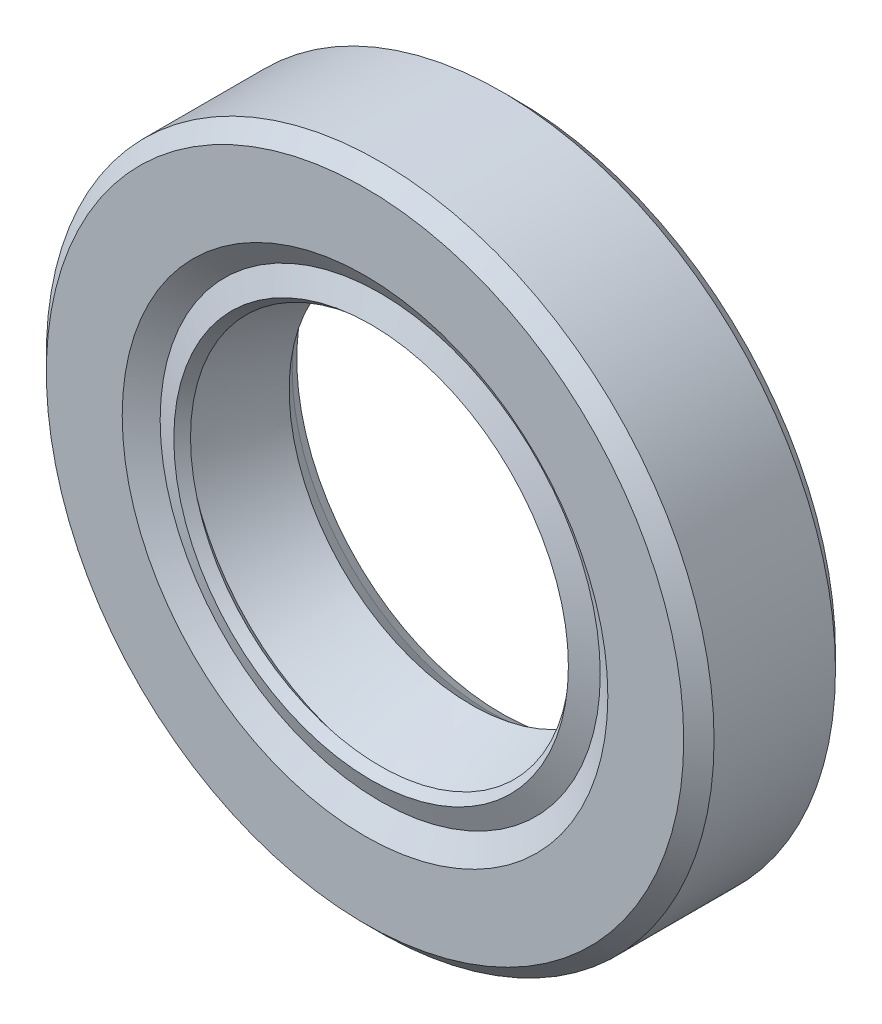
ISO-10303-21;
HEADER;
FILE_DESCRIPTION(('STEP AP214'),'2;1');
FILE_NAME('part.step','',(''),(''),'','','');
FILE_SCHEMA(('AUTOMOTIVE_DESIGN { 1 0 10303 214 1 1 1 1 }'));
ENDSEC;
DATA;
#1=APPLICATION_CONTEXT('core data for automotive mechanical design processes');
#2=APPLICATION_PROTOCOL_DEFINITION('international standard','automotive_design',2000,#1);
#3=PRODUCT_CONTEXT('',#1,'mechanical');
#4=PRODUCT('Part','Part','',(#3));
#5=PRODUCT_RELATED_PRODUCT_CATEGORY('part','',(#4));
#6=PRODUCT_DEFINITION_FORMATION('','',#4);
#7=PRODUCT_DEFINITION_CONTEXT('part definition',#1,'design');
#8=PRODUCT_DEFINITION('design','',#6,#7);
#9=PRODUCT_DEFINITION_SHAPE('','',#8);
#10=(LENGTH_UNIT() NAMED_UNIT(*) SI_UNIT(.MILLI.,.METRE.));
#11=(NAMED_UNIT(*) PLANE_ANGLE_UNIT() SI_UNIT($,.RADIAN.));
#12=(NAMED_UNIT(*) SI_UNIT($,.STERADIAN.) SOLID_ANGLE_UNIT());
#13=UNCERTAINTY_MEASURE_WITH_UNIT(LENGTH_MEASURE(1.E-05),#10,'distance_accuracy_value','');
#14=(GEOMETRIC_REPRESENTATION_CONTEXT(3) GLOBAL_UNCERTAINTY_ASSIGNED_CONTEXT((#13)) GLOBAL_UNIT_ASSIGNED_CONTEXT((#10,
#11,#12)) REPRESENTATION_CONTEXT('',''));
#15=CARTESIAN_POINT('',(0.,0.,0.));
#16=DIRECTION('',(0.,0.,1.));
#17=DIRECTION('',(1.,0.,0.));
#18=AXIS2_PLACEMENT_3D('',#15,#16,#17);
#19=CARTESIAN_POINT('',(0.,10.5,0.));
#20=DIRECTION('',(0.,0.,-1.));
#21=DIRECTION('',(-1.,0.,0.));
#22=AXIS2_PLACEMENT_3D('',#19,#20,#21);
#23=PLANE('',#22);
#24=CARTESIAN_POINT('',(0.,0.,0.));
#25=DIRECTION('',(0.,0.,1.));
#26=DIRECTION('',(1.,0.,0.));
#27=AXIS2_PLACEMENT_3D('',#24,#25,#26);
#28=CIRCLE('',#27,8.);
#29=CARTESIAN_POINT('',(8.,0.,0.));
#30=VERTEX_POINT('',#29);
#31=EDGE_CURVE('E10',#30,#30,#28,.T.);
#32=ORIENTED_EDGE('',*,*,#31,.F.);
#33=EDGE_LOOP('',(#32));
#34=FACE_BOUND('',#33,.T.);
#35=CARTESIAN_POINT('',(0.,0.,0.));
#36=DIRECTION('',(0.,0.,1.));
#37=DIRECTION('',(1.,0.,0.));
#38=AXIS2_PLACEMENT_3D('',#35,#36,#37);
#39=CIRCLE('',#38,10.5);
#40=CARTESIAN_POINT('',(10.5,0.,0.));
#41=VERTEX_POINT('',#40);
#42=EDGE_CURVE('E89',#41,#41,#39,.T.);
#43=ORIENTED_EDGE('',*,*,#42,.T.);
#44=EDGE_LOOP('',(#43));
#45=FACE_BOUND('',#44,.T.);
#46=ADVANCED_FACE('F31',(#34,#45),#23,.F.);
#47=CARTESIAN_POINT('',(0.,0.,0.));
#48=DIRECTION('',(0.,0.,1.));
#49=DIRECTION('',(1.,0.,0.));
#50=AXIS2_PLACEMENT_3D('',#47,#48,#49);
#51=CONICAL_SURFACE('',#50,8.,0.982793723247329);
#52=CARTESIAN_POINT('',(0.,0.,-0.5));
#53=DIRECTION('',(0.,0.,1.));
#54=DIRECTION('',(1.,0.,0.));
#55=AXIS2_PLACEMENT_3D('',#52,#53,#54);
#56=CIRCLE('',#55,7.25);
#57=CARTESIAN_POINT('',(7.25,0.,-0.5));
#58=VERTEX_POINT('',#57);
#59=EDGE_CURVE('E37',#58,#58,#56,.T.);
#60=ORIENTED_EDGE('',*,*,#59,.F.);
#61=EDGE_LOOP('',(#60));
#62=FACE_BOUND('',#61,.T.);
#63=ORIENTED_EDGE('',*,*,#31,.T.);
#64=EDGE_LOOP('',(#63));
#65=FACE_BOUND('',#64,.T.);
#66=ADVANCED_FACE('F186',(#62,#65),#51,.F.);
#67=CARTESIAN_POINT('',(0.,0.,-0.5));
#68=DIRECTION('',(0.,0.,-1.));
#69=DIRECTION('',(-1.,0.,0.));
#70=AXIS2_PLACEMENT_3D('',#67,#68,#69);
#71=CONICAL_SURFACE('',#70,7.25,1.19028994968253);
#72=CARTESIAN_POINT('',(0.,0.,-0.200000000000001));
#73=DIRECTION('',(0.,0.,1.));
#74=DIRECTION('',(1.,0.,0.));
#75=AXIS2_PLACEMENT_3D('',#72,#73,#74);
#76=CIRCLE('',#75,6.5);
#77=CARTESIAN_POINT('',(6.5,0.,-0.200000000000001));
#78=VERTEX_POINT('',#77);
#79=EDGE_CURVE('E41',#78,#78,#76,.T.);
#80=ORIENTED_EDGE('',*,*,#79,.F.);
#81=EDGE_LOOP('',(#80));
#82=FACE_BOUND('',#81,.T.);
#83=ORIENTED_EDGE('',*,*,#59,.T.);
#84=EDGE_LOOP('',(#83));
#85=FACE_BOUND('',#84,.T.);
#86=ADVANCED_FACE('F181',(#82,#85),#71,.T.);
#87=CARTESIAN_POINT('',(0.,0.,-0.200000000000001));
#88=DIRECTION('',(0.,0.,1.));
#89=DIRECTION('',(1.,0.,0.));
#90=AXIS2_PLACEMENT_3D('',#87,#88,#89);
#91=CONICAL_SURFACE('',#90,6.5,0.694738276196702);
#92=CARTESIAN_POINT('',(0.,0.,-0.500000000000001));
#93=DIRECTION('',(0.,0.,1.));
#94=DIRECTION('',(1.,0.,0.));
#95=AXIS2_PLACEMENT_3D('',#92,#93,#94);
#96=CIRCLE('',#95,6.25);
#97=CARTESIAN_POINT('',(6.25,0.,-0.500000000000001));
#98=VERTEX_POINT('',#97);
#99=EDGE_CURVE('E45',#98,#98,#96,.T.);
#100=ORIENTED_EDGE('',*,*,#99,.F.);
#101=EDGE_LOOP('',(#100));
#102=FACE_BOUND('',#101,.T.);
#103=ORIENTED_EDGE('',*,*,#79,.T.);
#104=EDGE_LOOP('',(#103));
#105=FACE_BOUND('',#104,.T.);
#106=ADVANCED_FACE('F175',(#102,#105),#91,.F.);
#107=CARTESIAN_POINT('',(0.,0.,-0.500000000000001));
#108=DIRECTION('',(0.,0.,-1.));
#109=DIRECTION('',(-1.,0.,0.));
#110=AXIS2_PLACEMENT_3D('',#107,#108,#109);
#111=CONICAL_SURFACE('',#110,6.25,0.896055384571344);
#112=CARTESIAN_POINT('',(0.,0.,-1.1));
#113=DIRECTION('',(0.,0.,1.));
#114=DIRECTION('',(1.,0.,0.));
#115=AXIS2_PLACEMENT_3D('',#112,#113,#114);
#116=CIRCLE('',#115,7.);
#117=CARTESIAN_POINT('',(7.,0.,-1.1));
#118=VERTEX_POINT('',#117);
#119=EDGE_CURVE('E50',#118,#118,#116,.T.);
#120=ORIENTED_EDGE('',*,*,#119,.F.);
#121=EDGE_LOOP('',(#120));
#122=FACE_BOUND('',#121,.T.);
#123=ORIENTED_EDGE('',*,*,#99,.T.);
#124=EDGE_LOOP('',(#123));
#125=FACE_BOUND('',#124,.T.);
#126=ADVANCED_FACE('F169',(#122,#125),#111,.F.);
#127=CARTESIAN_POINT('',(0.,0.,-1.1));
#128=DIRECTION('',(0.,0.,1.));
#129=DIRECTION('',(1.,0.,0.));
#130=AXIS2_PLACEMENT_3D('',#127,#128,#129);
#131=CONICAL_SURFACE('',#130,7.,0.394791119699763);
#132=CARTESIAN_POINT('',(0.,0.,-3.5));
#133=DIRECTION('',(0.,0.,1.));
#134=DIRECTION('',(1.,0.,0.));
#135=AXIS2_PLACEMENT_3D('',#132,#133,#134);
#136=CIRCLE('',#135,5.99999999999999);
#137=CARTESIAN_POINT('',(5.99999999999999,0.,-3.5));
#138=VERTEX_POINT('',#137);
#139=EDGE_CURVE('E53',#138,#138,#136,.T.);
#140=ORIENTED_EDGE('',*,*,#139,.F.);
#141=EDGE_LOOP('',(#140));
#142=FACE_BOUND('',#141,.T.);
#143=ORIENTED_EDGE('',*,*,#119,.T.);
#144=EDGE_LOOP('',(#143));
#145=FACE_BOUND('',#144,.T.);
#146=ADVANCED_FACE('F163',(#142,#145),#131,.F.);
#147=CARTESIAN_POINT('',(0.,0.,-3.5));
#148=DIRECTION('',(0.,0.,-1.));
#149=DIRECTION('',(-1.,0.,0.));
#150=AXIS2_PLACEMENT_3D('',#147,#148,#149);
#151=CONICAL_SURFACE('',#150,5.99999999999999,0.694738276196708);
#152=CARTESIAN_POINT('',(0.,0.,-4.1));
#153=DIRECTION('',(0.,0.,1.));
#154=DIRECTION('',(1.,0.,0.));
#155=AXIS2_PLACEMENT_3D('',#152,#153,#154);
#156=CIRCLE('',#155,6.5);
#157=CARTESIAN_POINT('',(6.5,0.,-4.1));
#158=VERTEX_POINT('',#157);
#159=EDGE_CURVE('E56',#158,#158,#156,.T.);
#160=ORIENTED_EDGE('',*,*,#159,.F.);
#161=EDGE_LOOP('',(#160));
#162=FACE_BOUND('',#161,.T.);
#163=ORIENTED_EDGE('',*,*,#139,.T.);
#164=EDGE_LOOP('',(#163));
#165=FACE_BOUND('',#164,.T.);
#166=ADVANCED_FACE('F157',(#162,#165),#151,.F.);
#167=CARTESIAN_POINT('',(0.,0.,-4.1));
#168=DIRECTION('',(0.,0.,-1.));
#169=DIRECTION('',(-1.,0.,0.));
#170=AXIS2_PLACEMENT_3D('',#167,#168,#169);
#171=CONICAL_SURFACE('',#170,6.5,0.558599315343563);
#172=CARTESIAN_POINT('',(0.,0.,-4.5));
#173=DIRECTION('',(0.,0.,1.));
#174=DIRECTION('',(1.,0.,0.));
#175=AXIS2_PLACEMENT_3D('',#172,#173,#174);
#176=CIRCLE('',#175,6.75);
#177=CARTESIAN_POINT('',(6.75,0.,-4.5));
#178=VERTEX_POINT('',#177);
#179=EDGE_CURVE('E59',#178,#178,#176,.T.);
#180=ORIENTED_EDGE('',*,*,#179,.F.);
#181=EDGE_LOOP('',(#180));
#182=FACE_BOUND('',#181,.T.);
#183=ORIENTED_EDGE('',*,*,#159,.T.);
#184=EDGE_LOOP('',(#183));
#185=FACE_BOUND('',#184,.T.);
#186=ADVANCED_FACE('F151',(#182,#185),#171,.F.);
#187=CARTESIAN_POINT('',(0.,6.75,-4.5));
#188=DIRECTION('',(0.,0.,1.));
#189=DIRECTION('',(1.,0.,0.));
#190=AXIS2_PLACEMENT_3D('',#187,#188,#189);
#191=PLANE('',#190);
#192=CARTESIAN_POINT('',(0.,0.,-4.5));
#193=DIRECTION('',(0.,0.,1.));
#194=DIRECTION('',(1.,0.,0.));
#195=AXIS2_PLACEMENT_3D('',#192,#193,#194);
#196=CIRCLE('',#195,7.1);
#197=CARTESIAN_POINT('',(7.1,0.,-4.5));
#198=VERTEX_POINT('',#197);
#199=EDGE_CURVE('E62',#198,#198,#196,.T.);
#200=ORIENTED_EDGE('',*,*,#199,.F.);
#201=EDGE_LOOP('',(#200));
#202=FACE_BOUND('',#201,.T.);
#203=ORIENTED_EDGE('',*,*,#179,.T.);
#204=EDGE_LOOP('',(#203));
#205=FACE_BOUND('',#204,.T.);
#206=ADVANCED_FACE('F145',(#202,#205),#191,.F.);
#207=CARTESIAN_POINT('',(0.,0.,-4.5));
#208=DIRECTION('',(0.,0.,1.));
#209=DIRECTION('',(1.,0.,0.));
#210=AXIS2_PLACEMENT_3D('',#207,#208,#209);
#211=CONICAL_SURFACE('',#210,7.1,0.256275350156349);
#212=CARTESIAN_POINT('',(0.,0.,-3.73674969975976));
#213=DIRECTION('',(0.,0.,1.));
#214=DIRECTION('',(1.,0.,0.));
#215=AXIS2_PLACEMENT_3D('',#212,#213,#214);
#216=CIRCLE('',#215,7.3);
#217=CARTESIAN_POINT('',(7.3,0.,-3.73674969975976));
#218=VERTEX_POINT('',#217);
#219=EDGE_CURVE('E65',#218,#218,#216,.T.);
#220=ORIENTED_EDGE('',*,*,#219,.F.);
#221=EDGE_LOOP('',(#220));
#222=FACE_BOUND('',#221,.T.);
#223=ORIENTED_EDGE('',*,*,#199,.T.);
#224=EDGE_LOOP('',(#223));
#225=FACE_BOUND('',#224,.T.);
#226=ADVANCED_FACE('F139',(#222,#225),#211,.T.);
#227=CARTESIAN_POINT('',(0.,0.,-2.8));
#228=DIRECTION('',(0.,0.,1.));
#229=DIRECTION('',(1.,0.,0.));
#230=AXIS2_PLACEMENT_3D('',#227,#228,#229);
#231=TOROIDAL_SURFACE('',#230,7.65,1.);
#232=CARTESIAN_POINT('',(0.,0.,-1.88348486100883));
#233=DIRECTION('',(0.,0.,1.));
#234=DIRECTION('',(1.,0.,0.));
#235=AXIS2_PLACEMENT_3D('',#232,#233,#234);
#236=CIRCLE('',#235,8.05);
#237=CARTESIAN_POINT('',(8.05,0.,-1.88348486100883));
#238=VERTEX_POINT('',#237);
#239=EDGE_CURVE('E68',#238,#238,#236,.T.);
#240=ORIENTED_EDGE('',*,*,#239,.F.);
#241=EDGE_LOOP('',(#240));
#242=FACE_BOUND('',#241,.T.);
#243=ORIENTED_EDGE('',*,*,#219,.T.);
#244=EDGE_LOOP('',(#243));
#245=FACE_BOUND('',#244,.T.);
#246=ADVANCED_FACE('F133',(#242,#245),#231,.T.);
#247=CARTESIAN_POINT('',(0.,0.,-1.88348486100883));
#248=DIRECTION('',(0.,0.,1.));
#249=DIRECTION('',(1.,0.,0.));
#250=AXIS2_PLACEMENT_3D('',#247,#248,#249);
#251=CONICAL_SURFACE('',#250,8.05,0.556824564712719);
#252=CARTESIAN_POINT('',(0.,0.,-1.));
#253=DIRECTION('',(0.,0.,1.));
#254=DIRECTION('',(1.,0.,0.));
#255=AXIS2_PLACEMENT_3D('',#252,#253,#254);
#256=CIRCLE('',#255,8.6);
#257=CARTESIAN_POINT('',(8.6,0.,-1.));
#258=VERTEX_POINT('',#257);
#259=EDGE_CURVE('E71',#258,#258,#256,.T.);
#260=ORIENTED_EDGE('',*,*,#259,.F.);
#261=EDGE_LOOP('',(#260));
#262=FACE_BOUND('',#261,.T.);
#263=ORIENTED_EDGE('',*,*,#239,.T.);
#264=EDGE_LOOP('',(#263));
#265=FACE_BOUND('',#264,.T.);
#266=ADVANCED_FACE('F127',(#262,#265),#251,.T.);
#267=CARTESIAN_POINT('',(0.,8.6,-1.));
#268=DIRECTION('',(0.,0.,1.));
#269=DIRECTION('',(1.,0.,0.));
#270=AXIS2_PLACEMENT_3D('',#267,#268,#269);
#271=PLANE('',#270);
#272=CARTESIAN_POINT('',(0.,0.,-1.));
#273=DIRECTION('',(0.,0.,1.));
#274=DIRECTION('',(1.,0.,0.));
#275=AXIS2_PLACEMENT_3D('',#272,#273,#274);
#276=CIRCLE('',#275,10.);
#277=CARTESIAN_POINT('',(10.,0.,-1.));
#278=VERTEX_POINT('',#277);
#279=EDGE_CURVE('E74',#278,#278,#276,.T.);
#280=ORIENTED_EDGE('',*,*,#279,.F.);
#281=EDGE_LOOP('',(#280));
#282=FACE_BOUND('',#281,.T.);
#283=ORIENTED_EDGE('',*,*,#259,.T.);
#284=EDGE_LOOP('',(#283));
#285=FACE_BOUND('',#284,.T.);
#286=ADVANCED_FACE('F121',(#282,#285),#271,.F.);
#287=CARTESIAN_POINT('',(0.,0.,0.));
#288=DIRECTION('',(0.,0.,1.));
#289=DIRECTION('',(1.,0.,0.));
#290=AXIS2_PLACEMENT_3D('',#287,#288,#289);
#291=CYLINDRICAL_SURFACE('',#290,10.);
#292=CARTESIAN_POINT('',(0.,0.,-5.));
#293=DIRECTION('',(0.,0.,1.));
#294=DIRECTION('',(1.,0.,0.));
#295=AXIS2_PLACEMENT_3D('',#292,#293,#294);
#296=CIRCLE('',#295,10.);
#297=CARTESIAN_POINT('',(10.,0.,-5.));
#298=VERTEX_POINT('',#297);
#299=EDGE_CURVE('E77',#298,#298,#296,.T.);
#300=ORIENTED_EDGE('',*,*,#299,.F.);
#301=EDGE_LOOP('',(#300));
#302=FACE_BOUND('',#301,.T.);
#303=ORIENTED_EDGE('',*,*,#279,.T.);
#304=EDGE_LOOP('',(#303));
#305=FACE_BOUND('',#304,.T.);
#306=ADVANCED_FACE('F115',(#302,#305),#291,.F.);
#307=CARTESIAN_POINT('',(0.,10.,-5.));
#308=DIRECTION('',(0.,0.,1.));
#309=DIRECTION('',(1.,0.,0.));
#310=AXIS2_PLACEMENT_3D('',#307,#308,#309);
#311=PLANE('',#310);
#312=CARTESIAN_POINT('',(0.,0.,-5.));
#313=DIRECTION('',(0.,0.,1.));
#314=DIRECTION('',(1.,0.,0.));
#315=AXIS2_PLACEMENT_3D('',#312,#313,#314);
#316=CIRCLE('',#315,10.5);
#317=CARTESIAN_POINT('',(10.5,0.,-5.));
#318=VERTEX_POINT('',#317);
#319=EDGE_CURVE('E80',#318,#318,#316,.T.);
#320=ORIENTED_EDGE('',*,*,#319,.F.);
#321=EDGE_LOOP('',(#320));
#322=FACE_BOUND('',#321,.T.);
#323=ORIENTED_EDGE('',*,*,#299,.T.);
#324=EDGE_LOOP('',(#323));
#325=FACE_BOUND('',#324,.T.);
#326=ADVANCED_FACE('F109',(#322,#325),#311,.F.);
#327=CARTESIAN_POINT('',(0.,0.,-5.));
#328=DIRECTION('',(0.,0.,1.));
#329=DIRECTION('',(1.,0.,0.));
#330=AXIS2_PLACEMENT_3D('',#327,#328,#329);
#331=CONICAL_SURFACE('',#330,10.5,0.785398163397449);
#332=CARTESIAN_POINT('',(0.,0.,-4.5));
#333=DIRECTION('',(0.,0.,1.));
#334=DIRECTION('',(1.,0.,0.));
#335=AXIS2_PLACEMENT_3D('',#332,#333,#334);
#336=CIRCLE('',#335,11.);
#337=CARTESIAN_POINT('',(11.,0.,-4.5));
#338=VERTEX_POINT('',#337);
#339=EDGE_CURVE('E83',#338,#338,#336,.T.);
#340=ORIENTED_EDGE('',*,*,#339,.F.);
#341=EDGE_LOOP('',(#340));
#342=FACE_BOUND('',#341,.T.);
#343=ORIENTED_EDGE('',*,*,#319,.T.);
#344=EDGE_LOOP('',(#343));
#345=FACE_BOUND('',#344,.T.);
#346=ADVANCED_FACE('F103',(#342,#345),#331,.T.);
#347=CARTESIAN_POINT('',(0.,0.,0.));
#348=DIRECTION('',(0.,0.,1.));
#349=DIRECTION('',(1.,0.,0.));
#350=AXIS2_PLACEMENT_3D('',#347,#348,#349);
#351=CYLINDRICAL_SURFACE('',#350,11.);
#352=CARTESIAN_POINT('',(0.,0.,-0.5));
#353=DIRECTION('',(0.,0.,1.));
#354=DIRECTION('',(1.,0.,0.));
#355=AXIS2_PLACEMENT_3D('',#352,#353,#354);
#356=CIRCLE('',#355,11.);
#357=CARTESIAN_POINT('',(11.,0.,-0.5));
#358=VERTEX_POINT('',#357);
#359=EDGE_CURVE('E86',#358,#358,#356,.T.);
#360=ORIENTED_EDGE('',*,*,#359,.F.);
#361=EDGE_LOOP('',(#360));
#362=FACE_BOUND('',#361,.T.);
#363=ORIENTED_EDGE('',*,*,#339,.T.);
#364=EDGE_LOOP('',(#363));
#365=FACE_BOUND('',#364,.T.);
#366=ADVANCED_FACE('F97',(#362,#365),#351,.T.);
#367=CARTESIAN_POINT('',(0.,0.,-0.5));
#368=DIRECTION('',(0.,0.,-1.));
#369=DIRECTION('',(-1.,0.,0.));
#370=AXIS2_PLACEMENT_3D('',#367,#368,#369);
#371=CONICAL_SURFACE('',#370,11.,0.78539816339745);
#372=ORIENTED_EDGE('',*,*,#42,.F.);
#373=EDGE_LOOP('',(#372));
#374=FACE_BOUND('',#373,.T.);
#375=ORIENTED_EDGE('',*,*,#359,.T.);
#376=EDGE_LOOP('',(#375));
#377=FACE_BOUND('',#376,.T.);
#378=ADVANCED_FACE('F94',(#374,#377),#371,.T.);
#379=CLOSED_SHELL('',(#46,#66,#86,#106,#126,#146,#166,#186,#206,#226,#246,#266,#286,#306,#326,
#346,#366,#378));
#380=MANIFOLD_SOLID_BREP('B2',#379);
#381=ADVANCED_BREP_SHAPE_REPRESENTATION('',(#18,#380),#14);
#382=SHAPE_DEFINITION_REPRESENTATION(#9,#381);
ENDSEC;
END-ISO-10303-21;
